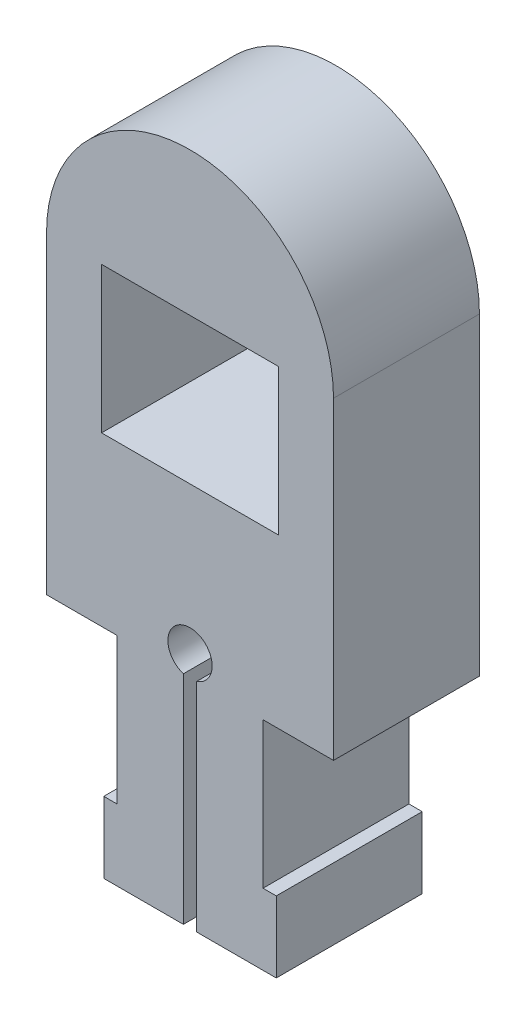
ISO-10303-21;
HEADER;
FILE_DESCRIPTION(('STEP AP214'),'2;1');
FILE_NAME('part.step','',(''),(''),'','','');
FILE_SCHEMA(('AUTOMOTIVE_DESIGN { 1 0 10303 214 1 1 1 1 }'));
ENDSEC;
DATA;
#1=APPLICATION_CONTEXT('core data for automotive mechanical design processes');
#2=APPLICATION_PROTOCOL_DEFINITION('international standard','automotive_design',2000,#1);
#3=PRODUCT_CONTEXT('',#1,'mechanical');
#4=PRODUCT('Part','Part','',(#3));
#5=PRODUCT_RELATED_PRODUCT_CATEGORY('part','',(#4));
#6=PRODUCT_DEFINITION_FORMATION('','',#4);
#7=PRODUCT_DEFINITION_CONTEXT('part definition',#1,'design');
#8=PRODUCT_DEFINITION('design','',#6,#7);
#9=PRODUCT_DEFINITION_SHAPE('','',#8);
#10=(LENGTH_UNIT() NAMED_UNIT(*) SI_UNIT(.MILLI.,.METRE.));
#11=(NAMED_UNIT(*) PLANE_ANGLE_UNIT() SI_UNIT($,.RADIAN.));
#12=(NAMED_UNIT(*) SI_UNIT($,.STERADIAN.) SOLID_ANGLE_UNIT());
#13=UNCERTAINTY_MEASURE_WITH_UNIT(LENGTH_MEASURE(1.E-05),#10,'distance_accuracy_value','');
#14=(GEOMETRIC_REPRESENTATION_CONTEXT(3) GLOBAL_UNCERTAINTY_ASSIGNED_CONTEXT((#13)) GLOBAL_UNIT_ASSIGNED_CONTEXT((#10,
#11,#12)) REPRESENTATION_CONTEXT('',''));
#15=CARTESIAN_POINT('',(0.,0.,0.));
#16=DIRECTION('',(0.,0.,1.));
#17=DIRECTION('',(1.,0.,0.));
#18=AXIS2_PLACEMENT_3D('',#15,#16,#17);
#19=CARTESIAN_POINT('',(-0.150000000000001,0.,3.3));
#20=DIRECTION('',(1.,0.,0.));
#21=DIRECTION('',(0.,1.,0.));
#22=AXIS2_PLACEMENT_3D('',#19,#20,#21);
#23=PLANE('',#22);
#24=DIRECTION('',(0.,-1.,0.));
#25=VECTOR('',#24,1.);
#26=CARTESIAN_POINT('',(-0.150000000000001,0.,0.));
#27=LINE('',#26,#25);
#28=CARTESIAN_POINT('',(-0.15,-0.476969600708473,0.));
#29=VERTEX_POINT('',#28);
#30=CARTESIAN_POINT('',(-0.15,-5.3848483352345,0.));
#31=VERTEX_POINT('',#30);
#32=EDGE_CURVE('E339',#29,#31,#27,.T.);
#33=ORIENTED_EDGE('',*,*,#32,.F.);
#34=DIRECTION('',(0.,0.,-1.));
#35=VECTOR('',#34,1.);
#36=CARTESIAN_POINT('',(-0.15,-0.476969600708473,3.3));
#37=LINE('',#36,#35);
#38=CARTESIAN_POINT('',(-0.15,-0.476969600708473,3.3));
#39=VERTEX_POINT('',#38);
#40=EDGE_CURVE('E11',#39,#29,#37,.T.);
#41=ORIENTED_EDGE('',*,*,#40,.F.);
#42=DIRECTION('',(0.,-1.,0.));
#43=VECTOR('',#42,1.);
#44=CARTESIAN_POINT('',(-0.150000000000001,0.,3.3));
#45=LINE('',#44,#43);
#46=CARTESIAN_POINT('',(-0.15,-5.3848483352345,3.3));
#47=VERTEX_POINT('',#46);
#48=EDGE_CURVE('E398',#39,#47,#45,.T.);
#49=ORIENTED_EDGE('',*,*,#48,.T.);
#50=DIRECTION('',(0.,0.,-1.));
#51=VECTOR('',#50,1.);
#52=CARTESIAN_POINT('',(-0.15,-5.3848483352345,3.3));
#53=LINE('',#52,#51);
#54=EDGE_CURVE('E70',#47,#31,#53,.T.);
#55=ORIENTED_EDGE('',*,*,#54,.T.);
#56=EDGE_LOOP('',(#33,#41,#49,#55));
#57=FACE_BOUND('',#56,.T.);
#58=ADVANCED_FACE('F50',(#57),#23,.T.);
#59=CARTESIAN_POINT('',(0.,0.,3.3));
#60=DIRECTION('',(0.,0.,-1.));
#61=DIRECTION('',(-1.,0.,0.));
#62=AXIS2_PLACEMENT_3D('',#59,#60,#61);
#63=CYLINDRICAL_SURFACE('',#62,0.5);
#64=CARTESIAN_POINT('',(0.,0.,0.));
#65=DIRECTION('',(0.,0.,1.));
#66=DIRECTION('',(1.,0.,0.));
#67=AXIS2_PLACEMENT_3D('',#64,#65,#66);
#68=CIRCLE('',#67,0.5);
#69=CARTESIAN_POINT('',(0.15,-0.476969600708473,0.));
#70=VERTEX_POINT('',#69);
#71=EDGE_CURVE('E335',#29,#70,#68,.F.);
#72=ORIENTED_EDGE('',*,*,#71,.T.);
#73=DIRECTION('',(0.,0.,-1.));
#74=VECTOR('',#73,1.);
#75=CARTESIAN_POINT('',(0.15,-0.476969600708473,3.3));
#76=LINE('',#75,#74);
#77=CARTESIAN_POINT('',(0.15,-0.476969600708473,3.3));
#78=VERTEX_POINT('',#77);
#79=EDGE_CURVE('E59',#78,#70,#76,.T.);
#80=ORIENTED_EDGE('',*,*,#79,.F.);
#81=CARTESIAN_POINT('',(0.,0.,3.3));
#82=DIRECTION('',(0.,0.,1.));
#83=DIRECTION('',(1.,0.,0.));
#84=AXIS2_PLACEMENT_3D('',#81,#82,#83);
#85=CIRCLE('',#84,0.5);
#86=EDGE_CURVE('E392',#39,#78,#85,.F.);
#87=ORIENTED_EDGE('',*,*,#86,.F.);
#88=ORIENTED_EDGE('',*,*,#40,.T.);
#89=EDGE_LOOP('',(#72,#80,#87,#88));
#90=FACE_BOUND('',#89,.T.);
#91=ADVANCED_FACE('F434',(#90),#63,.F.);
#92=CARTESIAN_POINT('',(0.15,0.,3.3));
#93=DIRECTION('',(1.,0.,0.));
#94=DIRECTION('',(0.,1.,0.));
#95=AXIS2_PLACEMENT_3D('',#92,#93,#94);
#96=PLANE('',#95);
#97=DIRECTION('',(0.,-1.,0.));
#98=VECTOR('',#97,1.);
#99=CARTESIAN_POINT('',(0.15,0.,0.));
#100=LINE('',#99,#98);
#101=CARTESIAN_POINT('',(0.15,-5.3848483352345,0.));
#102=VERTEX_POINT('',#101);
#103=EDGE_CURVE('E327',#70,#102,#100,.T.);
#104=ORIENTED_EDGE('',*,*,#103,.T.);
#105=DIRECTION('',(0.,0.,-1.));
#106=VECTOR('',#105,1.);
#107=CARTESIAN_POINT('',(0.15,-5.3848483352345,3.3));
#108=LINE('',#107,#106);
#109=CARTESIAN_POINT('',(0.15,-5.3848483352345,3.3));
#110=VERTEX_POINT('',#109);
#111=EDGE_CURVE('E254',#110,#102,#108,.T.);
#112=ORIENTED_EDGE('',*,*,#111,.F.);
#113=DIRECTION('',(0.,-1.,0.));
#114=VECTOR('',#113,1.);
#115=CARTESIAN_POINT('',(0.15,0.,3.3));
#116=LINE('',#115,#114);
#117=EDGE_CURVE('E394',#78,#110,#116,.T.);
#118=ORIENTED_EDGE('',*,*,#117,.F.);
#119=ORIENTED_EDGE('',*,*,#79,.T.);
#120=EDGE_LOOP('',(#104,#112,#118,#119));
#121=FACE_BOUND('',#120,.T.);
#122=ADVANCED_FACE('F439',(#121),#96,.F.);
#123=CARTESIAN_POINT('',(0.,-5.3848483352345,3.3));
#124=DIRECTION('',(0.,1.,0.));
#125=DIRECTION('',(0.,0.,1.));
#126=AXIS2_PLACEMENT_3D('',#123,#124,#125);
#127=PLANE('',#126);
#128=DIRECTION('',(1.,0.,0.));
#129=VECTOR('',#128,1.);
#130=CARTESIAN_POINT('',(0.,-5.3848483352345,0.));
#131=LINE('',#130,#129);
#132=CARTESIAN_POINT('',(1.95,-5.3848483352345,0.));
#133=VERTEX_POINT('',#132);
#134=EDGE_CURVE('E322',#102,#133,#131,.T.);
#135=ORIENTED_EDGE('',*,*,#134,.T.);
#136=DIRECTION('',(0.,0.,-1.));
#137=VECTOR('',#136,1.);
#138=CARTESIAN_POINT('',(1.95,-5.3848483352345,3.3));
#139=LINE('',#138,#137);
#140=CARTESIAN_POINT('',(1.95,-5.3848483352345,3.3));
#141=VERTEX_POINT('',#140);
#142=EDGE_CURVE('E252',#141,#133,#139,.T.);
#143=ORIENTED_EDGE('',*,*,#142,.F.);
#144=DIRECTION('',(1.,0.,0.));
#145=VECTOR('',#144,1.);
#146=CARTESIAN_POINT('',(0.,-5.3848483352345,3.3));
#147=LINE('',#146,#145);
#148=EDGE_CURVE('E389',#110,#141,#147,.T.);
#149=ORIENTED_EDGE('',*,*,#148,.F.);
#150=ORIENTED_EDGE('',*,*,#111,.T.);
#151=EDGE_LOOP('',(#135,#143,#149,#150));
#152=FACE_BOUND('',#151,.T.);
#153=ADVANCED_FACE('F449',(#152),#127,.F.);
#154=CARTESIAN_POINT('',(1.95,0.,3.3));
#155=DIRECTION('',(1.,0.,0.));
#156=DIRECTION('',(0.,1.,0.));
#157=AXIS2_PLACEMENT_3D('',#154,#155,#156);
#158=PLANE('',#157);
#159=DIRECTION('',(0.,-1.,0.));
#160=VECTOR('',#159,1.);
#161=CARTESIAN_POINT('',(1.95,0.,0.));
#162=LINE('',#161,#160);
#163=CARTESIAN_POINT('',(1.95,-3.77696960070847,0.));
#164=VERTEX_POINT('',#163);
#165=EDGE_CURVE('E319',#164,#133,#162,.T.);
#166=ORIENTED_EDGE('',*,*,#165,.F.);
#167=DIRECTION('',(0.,0.,-1.));
#168=VECTOR('',#167,1.);
#169=CARTESIAN_POINT('',(1.95,-3.77696960070847,3.3));
#170=LINE('',#169,#168);
#171=CARTESIAN_POINT('',(1.95,-3.77696960070847,3.3));
#172=VERTEX_POINT('',#171);
#173=EDGE_CURVE('E248',#172,#164,#170,.T.);
#174=ORIENTED_EDGE('',*,*,#173,.F.);
#175=DIRECTION('',(0.,-1.,0.));
#176=VECTOR('',#175,1.);
#177=CARTESIAN_POINT('',(1.95,0.,3.3));
#178=LINE('',#177,#176);
#179=EDGE_CURVE('E383',#172,#141,#178,.T.);
#180=ORIENTED_EDGE('',*,*,#179,.T.);
#181=ORIENTED_EDGE('',*,*,#142,.T.);
#182=EDGE_LOOP('',(#166,#174,#180,#181));
#183=FACE_BOUND('',#182,.T.);
#184=ADVANCED_FACE('F447',(#183),#158,.T.);
#185=CARTESIAN_POINT('',(0.,-3.77696960070847,3.3));
#186=DIRECTION('',(0.,1.,0.));
#187=DIRECTION('',(0.,0.,1.));
#188=AXIS2_PLACEMENT_3D('',#185,#186,#187);
#189=PLANE('',#188);
#190=DIRECTION('',(1.,0.,0.));
#191=VECTOR('',#190,1.);
#192=CARTESIAN_POINT('',(0.,-3.77696960070847,0.));
#193=LINE('',#192,#191);
#194=CARTESIAN_POINT('',(1.65,-3.77696960070847,0.));
#195=VERTEX_POINT('',#194);
#196=EDGE_CURVE('E316',#195,#164,#193,.T.);
#197=ORIENTED_EDGE('',*,*,#196,.F.);
#198=DIRECTION('',(0.,0.,-1.));
#199=VECTOR('',#198,1.);
#200=CARTESIAN_POINT('',(1.65,-3.77696960070847,3.3));
#201=LINE('',#200,#199);
#202=CARTESIAN_POINT('',(1.65,-3.77696960070847,3.3));
#203=VERTEX_POINT('',#202);
#204=EDGE_CURVE('E246',#203,#195,#201,.T.);
#205=ORIENTED_EDGE('',*,*,#204,.F.);
#206=DIRECTION('',(1.,0.,0.));
#207=VECTOR('',#206,1.);
#208=CARTESIAN_POINT('',(0.,-3.77696960070847,3.3));
#209=LINE('',#208,#207);
#210=EDGE_CURVE('E379',#203,#172,#209,.T.);
#211=ORIENTED_EDGE('',*,*,#210,.T.);
#212=ORIENTED_EDGE('',*,*,#173,.T.);
#213=EDGE_LOOP('',(#197,#205,#211,#212));
#214=FACE_BOUND('',#213,.T.);
#215=ADVANCED_FACE('F453',(#214),#189,.T.);
#216=CARTESIAN_POINT('',(1.65,0.,3.3));
#217=DIRECTION('',(1.,0.,0.));
#218=DIRECTION('',(0.,1.,0.));
#219=AXIS2_PLACEMENT_3D('',#216,#217,#218);
#220=PLANE('',#219);
#221=DIRECTION('',(0.,-1.,0.));
#222=VECTOR('',#221,1.);
#223=CARTESIAN_POINT('',(1.65,0.,0.));
#224=LINE('',#223,#222);
#225=CARTESIAN_POINT('',(1.65,-0.476969600708472,0.));
#226=VERTEX_POINT('',#225);
#227=EDGE_CURVE('E315',#226,#195,#224,.T.);
#228=ORIENTED_EDGE('',*,*,#227,.F.);
#229=DIRECTION('',(0.,0.,-1.));
#230=VECTOR('',#229,1.);
#231=CARTESIAN_POINT('',(1.65,-0.476969600708472,3.3));
#232=LINE('',#231,#230);
#233=CARTESIAN_POINT('',(1.65,-0.476969600708472,3.3));
#234=VERTEX_POINT('',#233);
#235=EDGE_CURVE('E245',#234,#226,#232,.T.);
#236=ORIENTED_EDGE('',*,*,#235,.F.);
#237=DIRECTION('',(0.,-1.,0.));
#238=VECTOR('',#237,1.);
#239=CARTESIAN_POINT('',(1.65,0.,3.3));
#240=LINE('',#239,#238);
#241=EDGE_CURVE('E376',#234,#203,#240,.T.);
#242=ORIENTED_EDGE('',*,*,#241,.T.);
#243=ORIENTED_EDGE('',*,*,#204,.T.);
#244=EDGE_LOOP('',(#228,#236,#242,#243));
#245=FACE_BOUND('',#244,.T.);
#246=ADVANCED_FACE('F456',(#245),#220,.T.);
#247=CARTESIAN_POINT('',(0.,-0.476969600708472,3.3));
#248=DIRECTION('',(0.,-1.,0.));
#249=DIRECTION('',(1.,0.,0.));
#250=AXIS2_PLACEMENT_3D('',#247,#248,#249);
#251=PLANE('',#250);
#252=DIRECTION('',(-1.,0.,0.));
#253=VECTOR('',#252,1.);
#254=CARTESIAN_POINT('',(0.,-0.476969600708472,0.));
#255=LINE('',#254,#253);
#256=CARTESIAN_POINT('',(3.24401575003481,-0.476969600708472,0.));
#257=VERTEX_POINT('',#256);
#258=EDGE_CURVE('E306',#257,#226,#255,.T.);
#259=ORIENTED_EDGE('',*,*,#258,.F.);
#260=DIRECTION('',(0.,0.,-1.));
#261=VECTOR('',#260,1.);
#262=CARTESIAN_POINT('',(3.24401575003481,-0.476969600708472,3.3));
#263=LINE('',#262,#261);
#264=CARTESIAN_POINT('',(3.24401575003481,-0.476969600708472,3.3));
#265=VERTEX_POINT('',#264);
#266=EDGE_CURVE('E238',#265,#257,#263,.T.);
#267=ORIENTED_EDGE('',*,*,#266,.F.);
#268=DIRECTION('',(-1.,0.,0.));
#269=VECTOR('',#268,1.);
#270=CARTESIAN_POINT('',(0.,-0.476969600708472,3.3));
#271=LINE('',#270,#269);
#272=EDGE_CURVE('E375',#265,#234,#271,.T.);
#273=ORIENTED_EDGE('',*,*,#272,.T.);
#274=ORIENTED_EDGE('',*,*,#235,.T.);
#275=EDGE_LOOP('',(#259,#267,#273,#274));
#276=FACE_BOUND('',#275,.T.);
#277=ADVANCED_FACE('F461',(#276),#251,.T.);
#278=CARTESIAN_POINT('',(3.24401575003481,0.,3.3));
#279=DIRECTION('',(1.,0.,0.));
#280=DIRECTION('',(0.,0.,-1.));
#281=AXIS2_PLACEMENT_3D('',#278,#279,#280);
#282=PLANE('',#281);
#283=DIRECTION('',(0.,-1.,0.));
#284=VECTOR('',#283,1.);
#285=CARTESIAN_POINT('',(3.24401575003481,0.,0.));
#286=LINE('',#285,#284);
#287=CARTESIAN_POINT('',(3.24401575003482,6.6151516647655,0.));
#288=VERTEX_POINT('',#287);
#289=EDGE_CURVE('E303',#288,#257,#286,.T.);
#290=ORIENTED_EDGE('',*,*,#289,.F.);
#291=DIRECTION('',(0.,0.,-1.));
#292=VECTOR('',#291,1.);
#293=CARTESIAN_POINT('',(3.24401575003482,6.6151516647655,3.3));
#294=LINE('',#293,#292);
#295=CARTESIAN_POINT('',(3.24401575003482,6.6151516647655,3.3));
#296=VERTEX_POINT('',#295);
#297=EDGE_CURVE('E240',#296,#288,#294,.T.);
#298=ORIENTED_EDGE('',*,*,#297,.F.);
#299=DIRECTION('',(0.,-1.,0.));
#300=VECTOR('',#299,1.);
#301=CARTESIAN_POINT('',(3.24401575003481,0.,3.3));
#302=LINE('',#301,#300);
#303=EDGE_CURVE('E366',#296,#265,#302,.T.);
#304=ORIENTED_EDGE('',*,*,#303,.T.);
#305=ORIENTED_EDGE('',*,*,#266,.T.);
#306=EDGE_LOOP('',(#290,#298,#304,#305));
#307=FACE_BOUND('',#306,.T.);
#308=ADVANCED_FACE('F466',(#307),#282,.T.);
#309=CARTESIAN_POINT('',(0.,6.6151516647655,3.3));
#310=DIRECTION('',(0.,0.,-1.));
#311=DIRECTION('',(-1.,0.,0.));
#312=AXIS2_PLACEMENT_3D('',#309,#310,#311);
#313=CYLINDRICAL_SURFACE('',#312,3.24401575003482);
#314=CARTESIAN_POINT('',(0.,6.6151516647655,0.));
#315=DIRECTION('',(0.,0.,1.));
#316=DIRECTION('',(1.,0.,0.));
#317=AXIS2_PLACEMENT_3D('',#314,#315,#316);
#318=CIRCLE('',#317,3.24401575003482);
#319=CARTESIAN_POINT('',(-3.24401575003482,6.6151516647655,0.));
#320=VERTEX_POINT('',#319);
#321=EDGE_CURVE('E297',#320,#288,#318,.F.);
#322=ORIENTED_EDGE('',*,*,#321,.F.);
#323=DIRECTION('',(0.,0.,-1.));
#324=VECTOR('',#323,1.);
#325=CARTESIAN_POINT('',(-3.24401575003482,6.6151516647655,3.3));
#326=LINE('',#325,#324);
#327=CARTESIAN_POINT('',(-3.24401575003482,6.6151516647655,3.3));
#328=VERTEX_POINT('',#327);
#329=EDGE_CURVE('E233',#328,#320,#326,.T.);
#330=ORIENTED_EDGE('',*,*,#329,.F.);
#331=CARTESIAN_POINT('',(0.,6.6151516647655,3.3));
#332=DIRECTION('',(0.,0.,1.));
#333=DIRECTION('',(1.,0.,0.));
#334=AXIS2_PLACEMENT_3D('',#331,#332,#333);
#335=CIRCLE('',#334,3.24401575003482);
#336=EDGE_CURVE('E365',#328,#296,#335,.F.);
#337=ORIENTED_EDGE('',*,*,#336,.T.);
#338=ORIENTED_EDGE('',*,*,#297,.T.);
#339=EDGE_LOOP('',(#322,#330,#337,#338));
#340=FACE_BOUND('',#339,.T.);
#341=ADVANCED_FACE('F469',(#340),#313,.T.);
#342=CARTESIAN_POINT('',(-3.24401575003481,0.,3.3));
#343=DIRECTION('',(1.,0.,0.));
#344=DIRECTION('',(0.,1.,0.));
#345=AXIS2_PLACEMENT_3D('',#342,#343,#344);
#346=PLANE('',#345);
#347=DIRECTION('',(0.,-1.,0.));
#348=VECTOR('',#347,1.);
#349=CARTESIAN_POINT('',(-3.24401575003481,0.,0.));
#350=LINE('',#349,#348);
#351=CARTESIAN_POINT('',(-3.24401575003481,-0.476969600708473,0.));
#352=VERTEX_POINT('',#351);
#353=EDGE_CURVE('E299',#320,#352,#350,.T.);
#354=ORIENTED_EDGE('',*,*,#353,.T.);
#355=DIRECTION('',(0.,0.,-1.));
#356=VECTOR('',#355,1.);
#357=CARTESIAN_POINT('',(-3.24401575003481,-0.476969600708473,3.3));
#358=LINE('',#357,#356);
#359=CARTESIAN_POINT('',(-3.24401575003481,-0.476969600708473,3.3));
#360=VERTEX_POINT('',#359);
#361=EDGE_CURVE('E227',#360,#352,#358,.T.);
#362=ORIENTED_EDGE('',*,*,#361,.F.);
#363=DIRECTION('',(0.,-1.,0.));
#364=VECTOR('',#363,1.);
#365=CARTESIAN_POINT('',(-3.24401575003481,0.,3.3));
#366=LINE('',#365,#364);
#367=EDGE_CURVE('E359',#328,#360,#366,.T.);
#368=ORIENTED_EDGE('',*,*,#367,.F.);
#369=ORIENTED_EDGE('',*,*,#329,.T.);
#370=EDGE_LOOP('',(#354,#362,#368,#369));
#371=FACE_BOUND('',#370,.T.);
#372=ADVANCED_FACE('F475',(#371),#346,.F.);
#373=CARTESIAN_POINT('',(0.,-0.476969600708472,3.3));
#374=DIRECTION('',(0.,1.,0.));
#375=DIRECTION('',(-1.,0.,0.));
#376=AXIS2_PLACEMENT_3D('',#373,#374,#375);
#377=PLANE('',#376);
#378=DIRECTION('',(1.,0.,0.));
#379=VECTOR('',#378,1.);
#380=CARTESIAN_POINT('',(0.,-0.476969600708472,0.));
#381=LINE('',#380,#379);
#382=CARTESIAN_POINT('',(-1.65,-0.476969600708473,0.));
#383=VERTEX_POINT('',#382);
#384=EDGE_CURVE('E295',#352,#383,#381,.T.);
#385=ORIENTED_EDGE('',*,*,#384,.T.);
#386=DIRECTION('',(0.,0.,-1.));
#387=VECTOR('',#386,1.);
#388=CARTESIAN_POINT('',(-1.65,-0.476969600708473,3.3));
#389=LINE('',#388,#387);
#390=CARTESIAN_POINT('',(-1.65,-0.476969600708473,3.3));
#391=VERTEX_POINT('',#390);
#392=EDGE_CURVE('E225',#391,#383,#389,.T.);
#393=ORIENTED_EDGE('',*,*,#392,.F.);
#394=DIRECTION('',(1.,0.,0.));
#395=VECTOR('',#394,1.);
#396=CARTESIAN_POINT('',(0.,-0.476969600708472,3.3));
#397=LINE('',#396,#395);
#398=EDGE_CURVE('E360',#360,#391,#397,.T.);
#399=ORIENTED_EDGE('',*,*,#398,.F.);
#400=ORIENTED_EDGE('',*,*,#361,.T.);
#401=EDGE_LOOP('',(#385,#393,#399,#400));
#402=FACE_BOUND('',#401,.T.);
#403=ADVANCED_FACE('F476',(#402),#377,.F.);
#404=CARTESIAN_POINT('',(-1.65,0.,3.3));
#405=DIRECTION('',(1.,0.,0.));
#406=DIRECTION('',(0.,1.,0.));
#407=AXIS2_PLACEMENT_3D('',#404,#405,#406);
#408=PLANE('',#407);
#409=DIRECTION('',(0.,-1.,0.));
#410=VECTOR('',#409,1.);
#411=CARTESIAN_POINT('',(-1.65,0.,0.));
#412=LINE('',#411,#410);
#413=CARTESIAN_POINT('',(-1.65,-3.77696960070847,0.));
#414=VERTEX_POINT('',#413);
#415=EDGE_CURVE('E287',#383,#414,#412,.T.);
#416=ORIENTED_EDGE('',*,*,#415,.T.);
#417=DIRECTION('',(0.,0.,-1.));
#418=VECTOR('',#417,1.);
#419=CARTESIAN_POINT('',(-1.65,-3.77696960070847,3.3));
#420=LINE('',#419,#418);
#421=CARTESIAN_POINT('',(-1.65,-3.77696960070847,3.3));
#422=VERTEX_POINT('',#421);
#423=EDGE_CURVE('E217',#422,#414,#420,.T.);
#424=ORIENTED_EDGE('',*,*,#423,.F.);
#425=DIRECTION('',(0.,-1.,0.));
#426=VECTOR('',#425,1.);
#427=CARTESIAN_POINT('',(-1.65,0.,3.3));
#428=LINE('',#427,#426);
#429=EDGE_CURVE('E207',#391,#422,#428,.T.);
#430=ORIENTED_EDGE('',*,*,#429,.F.);
#431=ORIENTED_EDGE('',*,*,#392,.T.);
#432=EDGE_LOOP('',(#416,#424,#430,#431));
#433=FACE_BOUND('',#432,.T.);
#434=ADVANCED_FACE('F485',(#433),#408,.F.);
#435=CARTESIAN_POINT('',(0.,-3.77696960070848,3.3));
#436=DIRECTION('',(0.,-1.,0.));
#437=DIRECTION('',(1.,0.,0.));
#438=AXIS2_PLACEMENT_3D('',#435,#436,#437);
#439=PLANE('',#438);
#440=DIRECTION('',(-1.,0.,0.));
#441=VECTOR('',#440,1.);
#442=CARTESIAN_POINT('',(0.,-3.77696960070848,0.));
#443=LINE('',#442,#441);
#444=CARTESIAN_POINT('',(-1.95,-3.77696960070847,0.));
#445=VERTEX_POINT('',#444);
#446=EDGE_CURVE('E216',#414,#445,#443,.T.);
#447=ORIENTED_EDGE('',*,*,#446,.T.);
#448=DIRECTION('',(0.,0.,-1.));
#449=VECTOR('',#448,1.);
#450=CARTESIAN_POINT('',(-1.95,-3.77696960070847,3.3));
#451=LINE('',#450,#449);
#452=CARTESIAN_POINT('',(-1.95,-3.77696960070847,3.3));
#453=VERTEX_POINT('',#452);
#454=EDGE_CURVE('E197',#453,#445,#451,.T.);
#455=ORIENTED_EDGE('',*,*,#454,.F.);
#456=DIRECTION('',(-1.,0.,0.));
#457=VECTOR('',#456,1.);
#458=CARTESIAN_POINT('',(0.,-3.77696960070848,3.3));
#459=LINE('',#458,#457);
#460=EDGE_CURVE('E201',#422,#453,#459,.T.);
#461=ORIENTED_EDGE('',*,*,#460,.F.);
#462=ORIENTED_EDGE('',*,*,#423,.T.);
#463=EDGE_LOOP('',(#447,#455,#461,#462));
#464=FACE_BOUND('',#463,.T.);
#465=ADVANCED_FACE('F214',(#464),#439,.F.);
#466=CARTESIAN_POINT('',(-1.95,0.,3.3));
#467=DIRECTION('',(1.,0.,0.));
#468=DIRECTION('',(0.,1.,0.));
#469=AXIS2_PLACEMENT_3D('',#466,#467,#468);
#470=PLANE('',#469);
#471=DIRECTION('',(0.,-1.,0.));
#472=VECTOR('',#471,1.);
#473=CARTESIAN_POINT('',(-1.95,0.,0.));
#474=LINE('',#473,#472);
#475=CARTESIAN_POINT('',(-1.95,-5.3848483352345,0.));
#476=VERTEX_POINT('',#475);
#477=EDGE_CURVE('E285',#445,#476,#474,.T.);
#478=ORIENTED_EDGE('',*,*,#477,.T.);
#479=DIRECTION('',(0.,0.,-1.));
#480=VECTOR('',#479,1.);
#481=CARTESIAN_POINT('',(-1.95,-5.3848483352345,3.3));
#482=LINE('',#481,#480);
#483=CARTESIAN_POINT('',(-1.95,-5.3848483352345,3.3));
#484=VERTEX_POINT('',#483);
#485=EDGE_CURVE('E129',#484,#476,#482,.T.);
#486=ORIENTED_EDGE('',*,*,#485,.F.);
#487=DIRECTION('',(0.,-1.,0.));
#488=VECTOR('',#487,1.);
#489=CARTESIAN_POINT('',(-1.95,0.,3.3));
#490=LINE('',#489,#488);
#491=EDGE_CURVE('E192',#453,#484,#490,.T.);
#492=ORIENTED_EDGE('',*,*,#491,.F.);
#493=ORIENTED_EDGE('',*,*,#454,.T.);
#494=EDGE_LOOP('',(#478,#486,#492,#493));
#495=FACE_BOUND('',#494,.T.);
#496=ADVANCED_FACE('F194',(#495),#470,.F.);
#497=CARTESIAN_POINT('',(0.,6.6151516647655,3.3));
#498=DIRECTION('',(0.,1.,0.));
#499=DIRECTION('',(-1.,0.,0.));
#500=AXIS2_PLACEMENT_3D('',#497,#498,#499);
#501=PLANE('',#500);
#502=DIRECTION('',(1.,0.,0.));
#503=VECTOR('',#502,1.);
#504=CARTESIAN_POINT('',(0.,6.6151516647655,0.));
#505=LINE('',#504,#503);
#506=CARTESIAN_POINT('',(-2.,6.6151516647655,0.));
#507=VERTEX_POINT('',#506);
#508=CARTESIAN_POINT('',(2.,6.6151516647655,0.));
#509=VERTEX_POINT('',#508);
#510=EDGE_CURVE('E348',#507,#509,#505,.T.);
#511=ORIENTED_EDGE('',*,*,#510,.T.);
#512=DIRECTION('',(0.,0.,-1.));
#513=VECTOR('',#512,1.);
#514=CARTESIAN_POINT('',(2.,6.6151516647655,3.3));
#515=LINE('',#514,#513);
#516=CARTESIAN_POINT('',(2.,6.6151516647655,3.3));
#517=VERTEX_POINT('',#516);
#518=EDGE_CURVE('E51',#517,#509,#515,.T.);
#519=ORIENTED_EDGE('',*,*,#518,.F.);
#520=DIRECTION('',(1.,0.,0.));
#521=VECTOR('',#520,1.);
#522=CARTESIAN_POINT('',(0.,6.6151516647655,3.3));
#523=LINE('',#522,#521);
#524=CARTESIAN_POINT('',(-2.,6.6151516647655,3.3));
#525=VERTEX_POINT('',#524);
#526=EDGE_CURVE('E281',#525,#517,#523,.T.);
#527=ORIENTED_EDGE('',*,*,#526,.F.);
#528=DIRECTION('',(0.,0.,-1.));
#529=VECTOR('',#528,1.);
#530=CARTESIAN_POINT('',(-2.,6.6151516647655,3.3));
#531=LINE('',#530,#529);
#532=EDGE_CURVE('E265',#525,#507,#531,.T.);
#533=ORIENTED_EDGE('',*,*,#532,.T.);
#534=EDGE_LOOP('',(#511,#519,#527,#533));
#535=FACE_BOUND('',#534,.T.);
#536=ADVANCED_FACE('F47',(#535),#501,.F.);
#537=CARTESIAN_POINT('',(2.,0.,3.3));
#538=DIRECTION('',(1.,0.,0.));
#539=DIRECTION('',(0.,0.,-1.));
#540=AXIS2_PLACEMENT_3D('',#537,#538,#539);
#541=PLANE('',#540);
#542=DIRECTION('',(0.,-1.,0.));
#543=VECTOR('',#542,1.);
#544=CARTESIAN_POINT('',(2.,0.,0.));
#545=LINE('',#544,#543);
#546=CARTESIAN_POINT('',(2.,3.3151516647655,0.));
#547=VERTEX_POINT('',#546);
#548=EDGE_CURVE('E350',#509,#547,#545,.T.);
#549=ORIENTED_EDGE('',*,*,#548,.T.);
#550=DIRECTION('',(0.,0.,-1.));
#551=VECTOR('',#550,1.);
#552=CARTESIAN_POINT('',(2.,3.3151516647655,3.3));
#553=LINE('',#552,#551);
#554=CARTESIAN_POINT('',(2.,3.3151516647655,3.3));
#555=VERTEX_POINT('',#554);
#556=EDGE_CURVE('E270',#555,#547,#553,.T.);
#557=ORIENTED_EDGE('',*,*,#556,.F.);
#558=DIRECTION('',(0.,-1.,0.));
#559=VECTOR('',#558,1.);
#560=CARTESIAN_POINT('',(2.,0.,3.3));
#561=LINE('',#560,#559);
#562=EDGE_CURVE('E142',#517,#555,#561,.T.);
#563=ORIENTED_EDGE('',*,*,#562,.F.);
#564=ORIENTED_EDGE('',*,*,#518,.T.);
#565=EDGE_LOOP('',(#549,#557,#563,#564));
#566=FACE_BOUND('',#565,.T.);
#567=ADVANCED_FACE('F426',(#566),#541,.F.);
#568=CARTESIAN_POINT('',(0.,3.3151516647655,3.3));
#569=DIRECTION('',(0.,1.,0.));
#570=DIRECTION('',(-1.,0.,0.));
#571=AXIS2_PLACEMENT_3D('',#568,#569,#570);
#572=PLANE('',#571);
#573=DIRECTION('',(1.,0.,0.));
#574=VECTOR('',#573,1.);
#575=CARTESIAN_POINT('',(0.,3.3151516647655,0.));
#576=LINE('',#575,#574);
#577=CARTESIAN_POINT('',(-2.,3.3151516647655,0.));
#578=VERTEX_POINT('',#577);
#579=EDGE_CURVE('E342',#578,#547,#576,.T.);
#580=ORIENTED_EDGE('',*,*,#579,.F.);
#581=DIRECTION('',(0.,0.,-1.));
#582=VECTOR('',#581,1.);
#583=CARTESIAN_POINT('',(-2.,3.3151516647655,3.3));
#584=LINE('',#583,#582);
#585=CARTESIAN_POINT('',(-2.,3.3151516647655,3.3));
#586=VERTEX_POINT('',#585);
#587=EDGE_CURVE('E264',#586,#578,#584,.T.);
#588=ORIENTED_EDGE('',*,*,#587,.F.);
#589=DIRECTION('',(1.,0.,0.));
#590=VECTOR('',#589,1.);
#591=CARTESIAN_POINT('',(0.,3.3151516647655,3.3));
#592=LINE('',#591,#590);
#593=EDGE_CURVE('E409',#586,#555,#592,.T.);
#594=ORIENTED_EDGE('',*,*,#593,.T.);
#595=ORIENTED_EDGE('',*,*,#556,.T.);
#596=EDGE_LOOP('',(#580,#588,#594,#595));
#597=FACE_BOUND('',#596,.T.);
#598=ADVANCED_FACE('F424',(#597),#572,.T.);
#599=CARTESIAN_POINT('',(-2.,0.,3.3));
#600=DIRECTION('',(1.,0.,0.));
#601=DIRECTION('',(0.,1.,0.));
#602=AXIS2_PLACEMENT_3D('',#599,#600,#601);
#603=PLANE('',#602);
#604=DIRECTION('',(0.,-1.,0.));
#605=VECTOR('',#604,1.);
#606=CARTESIAN_POINT('',(-2.,0.,0.));
#607=LINE('',#606,#605);
#608=EDGE_CURVE('E338',#507,#578,#607,.T.);
#609=ORIENTED_EDGE('',*,*,#608,.F.);
#610=ORIENTED_EDGE('',*,*,#532,.F.);
#611=DIRECTION('',(0.,-1.,0.));
#612=VECTOR('',#611,1.);
#613=CARTESIAN_POINT('',(-2.,0.,3.3));
#614=LINE('',#613,#612);
#615=EDGE_CURVE('E405',#525,#586,#614,.T.);
#616=ORIENTED_EDGE('',*,*,#615,.T.);
#617=ORIENTED_EDGE('',*,*,#587,.T.);
#618=EDGE_LOOP('',(#609,#610,#616,#617));
#619=FACE_BOUND('',#618,.T.);
#620=ADVANCED_FACE('F421',(#619),#603,.T.);
#621=CARTESIAN_POINT('',(0.,-5.3848483352345,3.3));
#622=DIRECTION('',(0.,-1.,0.));
#623=DIRECTION('',(0.,0.,-1.));
#624=AXIS2_PLACEMENT_3D('',#621,#622,#623);
#625=PLANE('',#624);
#626=DIRECTION('',(-1.,0.,0.));
#627=VECTOR('',#626,1.);
#628=CARTESIAN_POINT('',(0.,-5.3848483352345,0.));
#629=LINE('',#628,#627);
#630=EDGE_CURVE('E279',#31,#476,#629,.T.);
#631=ORIENTED_EDGE('',*,*,#630,.F.);
#632=ORIENTED_EDGE('',*,*,#54,.F.);
#633=DIRECTION('',(-1.,0.,0.));
#634=VECTOR('',#633,1.);
#635=CARTESIAN_POINT('',(0.,-5.3848483352345,3.3));
#636=LINE('',#635,#634);
#637=EDGE_CURVE('E205',#47,#484,#636,.T.);
#638=ORIENTED_EDGE('',*,*,#637,.T.);
#639=ORIENTED_EDGE('',*,*,#485,.T.);
#640=EDGE_LOOP('',(#631,#632,#638,#639));
#641=FACE_BOUND('',#640,.T.);
#642=ADVANCED_FACE('F435',(#641),#625,.T.);
#643=CARTESIAN_POINT('',(0.,0.,3.3));
#644=DIRECTION('',(0.,0.,1.));
#645=DIRECTION('',(1.,0.,0.));
#646=AXIS2_PLACEMENT_3D('',#643,#644,#645);
#647=PLANE('',#646);
#648=ORIENTED_EDGE('',*,*,#526,.T.);
#649=ORIENTED_EDGE('',*,*,#562,.T.);
#650=ORIENTED_EDGE('',*,*,#593,.F.);
#651=ORIENTED_EDGE('',*,*,#615,.F.);
#652=EDGE_LOOP('',(#648,#649,#650,#651));
#653=FACE_BOUND('',#652,.T.);
#654=ORIENTED_EDGE('',*,*,#48,.F.);
#655=ORIENTED_EDGE('',*,*,#86,.T.);
#656=ORIENTED_EDGE('',*,*,#117,.T.);
#657=ORIENTED_EDGE('',*,*,#148,.T.);
#658=ORIENTED_EDGE('',*,*,#179,.F.);
#659=ORIENTED_EDGE('',*,*,#210,.F.);
#660=ORIENTED_EDGE('',*,*,#241,.F.);
#661=ORIENTED_EDGE('',*,*,#272,.F.);
#662=ORIENTED_EDGE('',*,*,#303,.F.);
#663=ORIENTED_EDGE('',*,*,#336,.F.);
#664=ORIENTED_EDGE('',*,*,#367,.T.);
#665=ORIENTED_EDGE('',*,*,#398,.T.);
#666=ORIENTED_EDGE('',*,*,#429,.T.);
#667=ORIENTED_EDGE('',*,*,#460,.T.);
#668=ORIENTED_EDGE('',*,*,#491,.T.);
#669=ORIENTED_EDGE('',*,*,#637,.F.);
#670=EDGE_LOOP('',(#654,#655,#656,#657,#658,#659,#660,#661,#662,#663,#664,#665,#666,#667,#668,#669));
#671=FACE_BOUND('',#670,.T.);
#672=ADVANCED_FACE('F210',(#653,#671),#647,.T.);
#673=CARTESIAN_POINT('',(0.,0.,0.));
#674=DIRECTION('',(0.,0.,1.));
#675=DIRECTION('',(1.,0.,0.));
#676=AXIS2_PLACEMENT_3D('',#673,#674,#675);
#677=PLANE('',#676);
#678=ORIENTED_EDGE('',*,*,#510,.F.);
#679=ORIENTED_EDGE('',*,*,#608,.T.);
#680=ORIENTED_EDGE('',*,*,#579,.T.);
#681=ORIENTED_EDGE('',*,*,#548,.F.);
#682=EDGE_LOOP('',(#678,#679,#680,#681));
#683=FACE_BOUND('',#682,.T.);
#684=ORIENTED_EDGE('',*,*,#32,.T.);
#685=ORIENTED_EDGE('',*,*,#630,.T.);
#686=ORIENTED_EDGE('',*,*,#477,.F.);
#687=ORIENTED_EDGE('',*,*,#446,.F.);
#688=ORIENTED_EDGE('',*,*,#415,.F.);
#689=ORIENTED_EDGE('',*,*,#384,.F.);
#690=ORIENTED_EDGE('',*,*,#353,.F.);
#691=ORIENTED_EDGE('',*,*,#321,.T.);
#692=ORIENTED_EDGE('',*,*,#289,.T.);
#693=ORIENTED_EDGE('',*,*,#258,.T.);
#694=ORIENTED_EDGE('',*,*,#227,.T.);
#695=ORIENTED_EDGE('',*,*,#196,.T.);
#696=ORIENTED_EDGE('',*,*,#165,.T.);
#697=ORIENTED_EDGE('',*,*,#134,.F.);
#698=ORIENTED_EDGE('',*,*,#103,.F.);
#699=ORIENTED_EDGE('',*,*,#71,.F.);
#700=EDGE_LOOP('',(#684,#685,#686,#687,#688,#689,#690,#691,#692,#693,#694,#695,#696,#697,#698,#699));
#701=FACE_BOUND('',#700,.T.);
#702=ADVANCED_FACE('F419',(#683,#701),#677,.F.);
#703=CLOSED_SHELL('',(#58,#91,#122,#153,#184,#215,#246,#277,#308,#341,#372,#403,#434,#465,#496,
#536,#567,#598,#620,#642,#672,#702));
#704=MANIFOLD_SOLID_BREP('B2',#703);
#705=ADVANCED_BREP_SHAPE_REPRESENTATION('',(#18,#704),#14);
#706=SHAPE_DEFINITION_REPRESENTATION(#9,#705);
ENDSEC;
END-ISO-10303-21;
